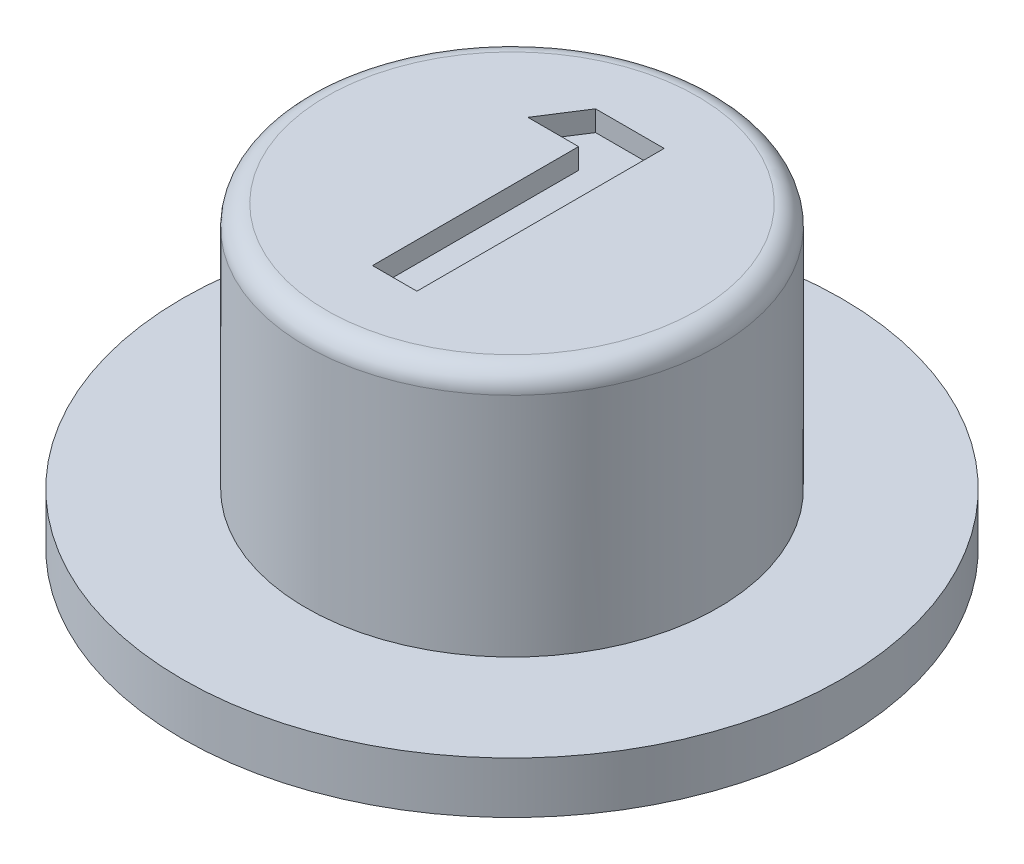
ISO-10303-21;
HEADER;
FILE_DESCRIPTION(('STEP AP214'),'2;1');
FILE_NAME('part.step','',(''),(''),'','','');
FILE_SCHEMA(('AUTOMOTIVE_DESIGN { 1 0 10303 214 1 1 1 1 }'));
ENDSEC;
DATA;
#1=APPLICATION_CONTEXT('core data for automotive mechanical design processes');
#2=APPLICATION_PROTOCOL_DEFINITION('international standard','automotive_design',2000,#1);
#3=PRODUCT_CONTEXT('',#1,'mechanical');
#4=PRODUCT('Part','Part','',(#3));
#5=PRODUCT_RELATED_PRODUCT_CATEGORY('part','',(#4));
#6=PRODUCT_DEFINITION_FORMATION('','',#4);
#7=PRODUCT_DEFINITION_CONTEXT('part definition',#1,'design');
#8=PRODUCT_DEFINITION('design','',#6,#7);
#9=PRODUCT_DEFINITION_SHAPE('','',#8);
#10=(LENGTH_UNIT() NAMED_UNIT(*) SI_UNIT(.MILLI.,.METRE.));
#11=(NAMED_UNIT(*) PLANE_ANGLE_UNIT() SI_UNIT($,.RADIAN.));
#12=(NAMED_UNIT(*) SI_UNIT($,.STERADIAN.) SOLID_ANGLE_UNIT());
#13=UNCERTAINTY_MEASURE_WITH_UNIT(LENGTH_MEASURE(1.E-05),#10,'distance_accuracy_value','');
#14=(GEOMETRIC_REPRESENTATION_CONTEXT(3) GLOBAL_UNCERTAINTY_ASSIGNED_CONTEXT((#13)) GLOBAL_UNIT_ASSIGNED_CONTEXT((#10,
#11,#12)) REPRESENTATION_CONTEXT('',''));
#15=CARTESIAN_POINT('',(0.,0.,0.));
#16=DIRECTION('',(0.,0.,1.));
#17=DIRECTION('',(1.,0.,0.));
#18=AXIS2_PLACEMENT_3D('',#15,#16,#17);
#19=CARTESIAN_POINT('',(0.,7.24999999999999,0.));
#20=DIRECTION('',(0.,-1.,0.));
#21=DIRECTION('',(1.,0.,0.));
#22=AXIS2_PLACEMENT_3D('',#19,#20,#21);
#23=PLANE('',#22);
#24=CARTESIAN_POINT('',(0.,7.24999999999999,0.));
#25=DIRECTION('',(0.,-1.,0.));
#26=DIRECTION('',(1.,0.,0.));
#27=AXIS2_PLACEMENT_3D('',#24,#25,#26);
#28=CIRCLE('',#27,4.49999999999999);
#29=CARTESIAN_POINT('',(4.49999999999999,7.25,0.));
#30=VERTEX_POINT('',#29);
#31=EDGE_CURVE('E41',#30,#30,#28,.F.);
#32=ORIENTED_EDGE('',*,*,#31,.T.);
#33=EDGE_LOOP('',(#32));
#34=FACE_BOUND('',#33,.T.);
#35=DIRECTION('',(0.540859777503419,0.,-0.841112775481952));
#36=VECTOR('',#35,1.);
#37=CARTESIAN_POINT('',(-1.61538461538463,7.24999999999999,-2.));
#38=LINE('',#37,#36);
#39=CARTESIAN_POINT('',(-1.61538461538463,7.24999999999999,-2.));
#40=VERTEX_POINT('',#39);
#41=CARTESIAN_POINT('',(-0.972355769230789,7.24999999999999,-3.));
#42=VERTEX_POINT('',#41);
#43=EDGE_CURVE('E48',#40,#42,#38,.T.);
#44=ORIENTED_EDGE('',*,*,#43,.T.);
#45=DIRECTION('',(1.,0.,0.));
#46=VECTOR('',#45,1.);
#47=CARTESIAN_POINT('',(-0.972355769230789,7.24999999999999,-3.));
#48=LINE('',#47,#46);
#49=CARTESIAN_POINT('',(0.692307692307673,7.24999999999999,-3.));
#50=VERTEX_POINT('',#49);
#51=EDGE_CURVE('E131',#42,#50,#48,.T.);
#52=ORIENTED_EDGE('',*,*,#51,.T.);
#53=DIRECTION('',(0.,0.,1.));
#54=VECTOR('',#53,1.);
#55=CARTESIAN_POINT('',(0.692307692307673,7.24999999999999,-3.));
#56=LINE('',#55,#54);
#57=CARTESIAN_POINT('',(0.692307692307673,7.24999999999999,3.));
#58=VERTEX_POINT('',#57);
#59=EDGE_CURVE('E377',#50,#58,#56,.T.);
#60=ORIENTED_EDGE('',*,*,#59,.T.);
#61=DIRECTION('',(-1.,0.,0.));
#62=VECTOR('',#61,1.);
#63=CARTESIAN_POINT('',(0.692307692307673,7.24999999999999,3.));
#64=LINE('',#63,#62);
#65=CARTESIAN_POINT('',(-0.384615384615404,7.24999999999999,3.));
#66=VERTEX_POINT('',#65);
#67=EDGE_CURVE('E374',#58,#66,#64,.T.);
#68=ORIENTED_EDGE('',*,*,#67,.T.);
#69=DIRECTION('',(0.,0.,-1.));
#70=VECTOR('',#69,1.);
#71=CARTESIAN_POINT('',(-0.384615384615404,7.24999999999999,3.));
#72=LINE('',#71,#70);
#73=CARTESIAN_POINT('',(-0.384615384615404,7.24999999999999,-2.));
#74=VERTEX_POINT('',#73);
#75=EDGE_CURVE('E368',#66,#74,#72,.T.);
#76=ORIENTED_EDGE('',*,*,#75,.T.);
#77=DIRECTION('',(-1.,0.,0.));
#78=VECTOR('',#77,1.);
#79=CARTESIAN_POINT('',(-0.384615384615404,7.24999999999999,-2.));
#80=LINE('',#79,#78);
#81=EDGE_CURVE('E127',#74,#40,#80,.T.);
#82=ORIENTED_EDGE('',*,*,#81,.T.);
#83=EDGE_LOOP('',(#44,#52,#60,#68,#76,#82));
#84=FACE_BOUND('',#83,.T.);
#85=ADVANCED_FACE('F33',(#34,#84),#23,.F.);
#86=CARTESIAN_POINT('',(0.,0.,0.));
#87=DIRECTION('',(0.,1.,0.));
#88=DIRECTION('',(-1.,0.,0.));
#89=AXIS2_PLACEMENT_3D('',#86,#87,#88);
#90=PLANE('',#89);
#91=CARTESIAN_POINT('',(0.,0.,0.));
#92=DIRECTION('',(0.,1.,0.));
#93=DIRECTION('',(-1.,0.,0.));
#94=AXIS2_PLACEMENT_3D('',#91,#92,#93);
#95=CIRCLE('',#94,7.99999999999998);
#96=CARTESIAN_POINT('',(-7.99999999999996,0.,0.));
#97=VERTEX_POINT('',#96);
#98=EDGE_CURVE('E173',#97,#97,#95,.T.);
#99=ORIENTED_EDGE('',*,*,#98,.F.);
#100=EDGE_LOOP('',(#99));
#101=FACE_BOUND('',#100,.T.);
#102=DIRECTION('',(0.,0.,1.));
#103=VECTOR('',#102,1.);
#104=CARTESIAN_POINT('',(-1.25,0.,-1.75));
#105=LINE('',#104,#103);
#106=CARTESIAN_POINT('',(-1.25,0.,-1.75));
#107=VERTEX_POINT('',#106);
#108=CARTESIAN_POINT('',(-1.25,0.,1.75));
#109=VERTEX_POINT('',#108);
#110=EDGE_CURVE('E56',#107,#109,#105,.T.);
#111=ORIENTED_EDGE('',*,*,#110,.T.);
#112=DIRECTION('',(1.,0.,0.));
#113=VECTOR('',#112,1.);
#114=CARTESIAN_POINT('',(-1.25,0.,1.75));
#115=LINE('',#114,#113);
#116=CARTESIAN_POINT('',(1.25,0.,1.75));
#117=VERTEX_POINT('',#116);
#118=EDGE_CURVE('E134',#109,#117,#115,.T.);
#119=ORIENTED_EDGE('',*,*,#118,.T.);
#120=DIRECTION('',(0.,0.,1.));
#121=VECTOR('',#120,1.);
#122=CARTESIAN_POINT('',(1.25,0.,-1.75));
#123=LINE('',#122,#121);
#124=CARTESIAN_POINT('',(1.25,0.,-1.75));
#125=VERTEX_POINT('',#124);
#126=EDGE_CURVE('E155',#125,#117,#123,.T.);
#127=ORIENTED_EDGE('',*,*,#126,.F.);
#128=DIRECTION('',(1.,0.,0.));
#129=VECTOR('',#128,1.);
#130=CARTESIAN_POINT('',(-1.25,0.,-1.75));
#131=LINE('',#130,#129);
#132=EDGE_CURVE('E144',#107,#125,#131,.T.);
#133=ORIENTED_EDGE('',*,*,#132,.F.);
#134=EDGE_LOOP('',(#111,#119,#127,#133));
#135=FACE_BOUND('',#134,.T.);
#136=ADVANCED_FACE('F193',(#101,#135),#90,.F.);
#137=CARTESIAN_POINT('',(0.,7.25,0.));
#138=DIRECTION('',(0.,1.,0.));
#139=DIRECTION('',(-1.,0.,0.));
#140=AXIS2_PLACEMENT_3D('',#137,#138,#139);
#141=CYLINDRICAL_SURFACE('',#140,7.99999999999998);
#142=CARTESIAN_POINT('',(0.,1.24999999999998,0.));
#143=DIRECTION('',(0.,1.,0.));
#144=DIRECTION('',(-1.,0.,0.));
#145=AXIS2_PLACEMENT_3D('',#142,#143,#144);
#146=CIRCLE('',#145,7.99999999999998);
#147=CARTESIAN_POINT('',(-7.99999999999997,1.24999999999996,0.));
#148=VERTEX_POINT('',#147);
#149=EDGE_CURVE('E170',#148,#148,#146,.T.);
#150=ORIENTED_EDGE('',*,*,#149,.F.);
#151=EDGE_LOOP('',(#150));
#152=FACE_BOUND('',#151,.T.);
#153=ORIENTED_EDGE('',*,*,#98,.T.);
#154=EDGE_LOOP('',(#153));
#155=FACE_BOUND('',#154,.T.);
#156=ADVANCED_FACE('F198',(#152,#155),#141,.T.);
#157=CARTESIAN_POINT('',(5.,1.25,0.));
#158=DIRECTION('',(0.,-1.,0.));
#159=DIRECTION('',(1.,0.,0.));
#160=AXIS2_PLACEMENT_3D('',#157,#158,#159);
#161=PLANE('',#160);
#162=CARTESIAN_POINT('',(0.,1.24999999999999,0.));
#163=DIRECTION('',(0.,1.,0.));
#164=DIRECTION('',(-1.,0.,0.));
#165=AXIS2_PLACEMENT_3D('',#162,#163,#164);
#166=CIRCLE('',#165,4.99999999999998);
#167=CARTESIAN_POINT('',(-4.99999999999997,1.24999999999997,0.));
#168=VERTEX_POINT('',#167);
#169=EDGE_CURVE('E167',#168,#168,#166,.T.);
#170=ORIENTED_EDGE('',*,*,#169,.F.);
#171=EDGE_LOOP('',(#170));
#172=FACE_BOUND('',#171,.T.);
#173=ORIENTED_EDGE('',*,*,#149,.T.);
#174=EDGE_LOOP('',(#173));
#175=FACE_BOUND('',#174,.T.);
#176=ADVANCED_FACE('F207',(#172,#175),#161,.F.);
#177=CARTESIAN_POINT('',(0.,7.25,0.));
#178=DIRECTION('',(0.,1.,0.));
#179=DIRECTION('',(-1.,0.,0.));
#180=AXIS2_PLACEMENT_3D('',#177,#178,#179);
#181=CYLINDRICAL_SURFACE('',#180,4.99999999999999);
#182=CARTESIAN_POINT('',(0.,6.74999999999999,0.));
#183=DIRECTION('',(0.,-1.,0.));
#184=DIRECTION('',(1.,0.,0.));
#185=AXIS2_PLACEMENT_3D('',#182,#183,#184);
#186=CIRCLE('',#185,4.99999999999999);
#187=CARTESIAN_POINT('',(4.99999999999999,6.75000000000001,0.));
#188=VERTEX_POINT('',#187);
#189=EDGE_CURVE('E11',#188,#188,#186,.T.);
#190=ORIENTED_EDGE('',*,*,#189,.T.);
#191=EDGE_LOOP('',(#190));
#192=FACE_BOUND('',#191,.T.);
#193=ORIENTED_EDGE('',*,*,#169,.T.);
#194=EDGE_LOOP('',(#193));
#195=FACE_BOUND('',#194,.T.);
#196=ADVANCED_FACE('F204',(#192,#195),#181,.T.);
#197=CARTESIAN_POINT('',(-1.25,3.5,-1.75));
#198=DIRECTION('',(1.,0.,0.));
#199=DIRECTION('',(0.,1.,0.));
#200=AXIS2_PLACEMENT_3D('',#197,#198,#199);
#201=PLANE('',#200);
#202=ORIENTED_EDGE('',*,*,#110,.F.);
#203=DIRECTION('',(0.,-1.,0.));
#204=VECTOR('',#203,1.);
#205=CARTESIAN_POINT('',(-1.25,3.5,-1.75));
#206=LINE('',#205,#204);
#207=CARTESIAN_POINT('',(-1.25,3.5,-1.75));
#208=VERTEX_POINT('',#207);
#209=EDGE_CURVE('E151',#208,#107,#206,.T.);
#210=ORIENTED_EDGE('',*,*,#209,.F.);
#211=DIRECTION('',(0.,0.,1.));
#212=VECTOR('',#211,1.);
#213=CARTESIAN_POINT('',(-1.25,3.5,-1.75));
#214=LINE('',#213,#212);
#215=CARTESIAN_POINT('',(-1.25,3.5,1.75));
#216=VERTEX_POINT('',#215);
#217=EDGE_CURVE('E140',#208,#216,#214,.T.);
#218=ORIENTED_EDGE('',*,*,#217,.T.);
#219=DIRECTION('',(0.,-1.,0.));
#220=VECTOR('',#219,1.);
#221=CARTESIAN_POINT('',(-1.25,3.5,1.75));
#222=LINE('',#221,#220);
#223=EDGE_CURVE('E165',#216,#109,#222,.T.);
#224=ORIENTED_EDGE('',*,*,#223,.T.);
#225=EDGE_LOOP('',(#202,#210,#218,#224));
#226=FACE_BOUND('',#225,.T.);
#227=ADVANCED_FACE('F202',(#226),#201,.T.);
#228=CARTESIAN_POINT('',(-1.25,3.5,1.75));
#229=DIRECTION('',(0.,0.,-1.));
#230=DIRECTION('',(-1.,0.,0.));
#231=AXIS2_PLACEMENT_3D('',#228,#229,#230);
#232=PLANE('',#231);
#233=ORIENTED_EDGE('',*,*,#118,.F.);
#234=ORIENTED_EDGE('',*,*,#223,.F.);
#235=DIRECTION('',(1.,0.,0.));
#236=VECTOR('',#235,1.);
#237=CARTESIAN_POINT('',(-1.25,3.5,1.75));
#238=LINE('',#237,#236);
#239=CARTESIAN_POINT('',(1.25,3.5,1.75));
#240=VERTEX_POINT('',#239);
#241=EDGE_CURVE('E143',#216,#240,#238,.T.);
#242=ORIENTED_EDGE('',*,*,#241,.T.);
#243=DIRECTION('',(0.,-1.,0.));
#244=VECTOR('',#243,1.);
#245=CARTESIAN_POINT('',(1.25,3.5,1.75));
#246=LINE('',#245,#244);
#247=EDGE_CURVE('E163',#240,#117,#246,.T.);
#248=ORIENTED_EDGE('',*,*,#247,.T.);
#249=EDGE_LOOP('',(#233,#234,#242,#248));
#250=FACE_BOUND('',#249,.T.);
#251=ADVANCED_FACE('F229',(#250),#232,.T.);
#252=CARTESIAN_POINT('',(1.25,3.5,-1.75));
#253=DIRECTION('',(1.,0.,0.));
#254=DIRECTION('',(0.,1.,0.));
#255=AXIS2_PLACEMENT_3D('',#252,#253,#254);
#256=PLANE('',#255);
#257=ORIENTED_EDGE('',*,*,#126,.T.);
#258=ORIENTED_EDGE('',*,*,#247,.F.);
#259=DIRECTION('',(0.,0.,1.));
#260=VECTOR('',#259,1.);
#261=CARTESIAN_POINT('',(1.25,3.5,-1.75));
#262=LINE('',#261,#260);
#263=CARTESIAN_POINT('',(1.25,3.5,-1.75));
#264=VERTEX_POINT('',#263);
#265=EDGE_CURVE('E146',#264,#240,#262,.T.);
#266=ORIENTED_EDGE('',*,*,#265,.F.);
#267=DIRECTION('',(0.,-1.,0.));
#268=VECTOR('',#267,1.);
#269=CARTESIAN_POINT('',(1.25,3.5,-1.75));
#270=LINE('',#269,#268);
#271=EDGE_CURVE('E161',#264,#125,#270,.T.);
#272=ORIENTED_EDGE('',*,*,#271,.T.);
#273=EDGE_LOOP('',(#257,#258,#266,#272));
#274=FACE_BOUND('',#273,.T.);
#275=ADVANCED_FACE('F231',(#274),#256,.F.);
#276=CARTESIAN_POINT('',(-1.25,3.5,-1.75));
#277=DIRECTION('',(0.,0.,-1.));
#278=DIRECTION('',(-1.,0.,0.));
#279=AXIS2_PLACEMENT_3D('',#276,#277,#278);
#280=PLANE('',#279);
#281=ORIENTED_EDGE('',*,*,#132,.T.);
#282=ORIENTED_EDGE('',*,*,#271,.F.);
#283=DIRECTION('',(1.,0.,0.));
#284=VECTOR('',#283,1.);
#285=CARTESIAN_POINT('',(-1.25,3.5,-1.75));
#286=LINE('',#285,#284);
#287=EDGE_CURVE('E149',#208,#264,#286,.T.);
#288=ORIENTED_EDGE('',*,*,#287,.F.);
#289=ORIENTED_EDGE('',*,*,#209,.T.);
#290=EDGE_LOOP('',(#281,#282,#288,#289));
#291=FACE_BOUND('',#290,.T.);
#292=ADVANCED_FACE('F188',(#291),#280,.F.);
#293=CARTESIAN_POINT('',(0.,3.5,0.));
#294=DIRECTION('',(0.,1.,0.));
#295=DIRECTION('',(-1.,0.,0.));
#296=AXIS2_PLACEMENT_3D('',#293,#294,#295);
#297=PLANE('',#296);
#298=ORIENTED_EDGE('',*,*,#217,.F.);
#299=ORIENTED_EDGE('',*,*,#287,.T.);
#300=ORIENTED_EDGE('',*,*,#265,.T.);
#301=ORIENTED_EDGE('',*,*,#241,.F.);
#302=EDGE_LOOP('',(#298,#299,#300,#301));
#303=FACE_BOUND('',#302,.T.);
#304=ADVANCED_FACE('F181',(#303),#297,.F.);
#305=CARTESIAN_POINT('',(0.,6.74999999999999,0.));
#306=DIRECTION('',(0.,-1.,0.));
#307=DIRECTION('',(1.,0.,0.));
#308=AXIS2_PLACEMENT_3D('',#305,#306,#307);
#309=TOROIDAL_SURFACE('',#308,4.49999999999999,0.5);
#310=ORIENTED_EDGE('',*,*,#189,.F.);
#311=EDGE_LOOP('',(#310));
#312=FACE_BOUND('',#311,.T.);
#313=ORIENTED_EDGE('',*,*,#31,.F.);
#314=EDGE_LOOP('',(#313));
#315=FACE_BOUND('',#314,.T.);
#316=ADVANCED_FACE('F35',(#312,#315),#309,.T.);
#317=CARTESIAN_POINT('',(-1.61538461538463,6.74999999999999,-2.));
#318=DIRECTION('',(0.841112775481952,0.,0.540859777503419));
#319=DIRECTION('',(0.540859777503419,0.,-0.841112775481952));
#320=AXIS2_PLACEMENT_3D('',#317,#318,#319);
#321=PLANE('',#320);
#322=ORIENTED_EDGE('',*,*,#43,.F.);
#323=DIRECTION('',(0.,1.,0.));
#324=VECTOR('',#323,1.);
#325=CARTESIAN_POINT('',(-1.61538461538463,6.74999999999999,-2.));
#326=LINE('',#325,#324);
#327=CARTESIAN_POINT('',(-1.61538461538463,6.74999999999999,-2.));
#328=VERTEX_POINT('',#327);
#329=EDGE_CURVE('E126',#328,#40,#326,.T.);
#330=ORIENTED_EDGE('',*,*,#329,.F.);
#331=DIRECTION('',(0.540859777503419,0.,-0.841112775481952));
#332=VECTOR('',#331,1.);
#333=CARTESIAN_POINT('',(-1.61538461538463,6.74999999999999,-2.));
#334=LINE('',#333,#332);
#335=CARTESIAN_POINT('',(-0.972355769230788,6.74999999999999,-3.));
#336=VERTEX_POINT('',#335);
#337=EDGE_CURVE('E117',#328,#336,#334,.T.);
#338=ORIENTED_EDGE('',*,*,#337,.T.);
#339=DIRECTION('',(0.,1.,0.));
#340=VECTOR('',#339,1.);
#341=CARTESIAN_POINT('',(-0.972355769230788,6.74999999999999,-3.));
#342=LINE('',#341,#340);
#343=EDGE_CURVE('E125',#336,#42,#342,.T.);
#344=ORIENTED_EDGE('',*,*,#343,.T.);
#345=EDGE_LOOP('',(#322,#330,#338,#344));
#346=FACE_BOUND('',#345,.T.);
#347=ADVANCED_FACE('F124',(#346),#321,.T.);
#348=CARTESIAN_POINT('',(-0.972355769230788,6.74999999999999,-3.));
#349=DIRECTION('',(0.,0.,1.));
#350=DIRECTION('',(1.,0.,0.));
#351=AXIS2_PLACEMENT_3D('',#348,#349,#350);
#352=PLANE('',#351);
#353=ORIENTED_EDGE('',*,*,#51,.F.);
#354=ORIENTED_EDGE('',*,*,#343,.F.);
#355=DIRECTION('',(1.,0.,0.));
#356=VECTOR('',#355,1.);
#357=CARTESIAN_POINT('',(-0.972355769230788,6.74999999999999,-3.));
#358=LINE('',#357,#356);
#359=CARTESIAN_POINT('',(0.692307692307674,6.74999999999999,-3.));
#360=VERTEX_POINT('',#359);
#361=EDGE_CURVE('E113',#336,#360,#358,.T.);
#362=ORIENTED_EDGE('',*,*,#361,.T.);
#363=DIRECTION('',(0.,1.,0.));
#364=VECTOR('',#363,1.);
#365=CARTESIAN_POINT('',(0.692307692307674,6.74999999999999,-3.));
#366=LINE('',#365,#364);
#367=EDGE_CURVE('E132',#360,#50,#366,.T.);
#368=ORIENTED_EDGE('',*,*,#367,.T.);
#369=EDGE_LOOP('',(#353,#354,#362,#368));
#370=FACE_BOUND('',#369,.T.);
#371=ADVANCED_FACE('F129',(#370),#352,.T.);
#372=CARTESIAN_POINT('',(0.692307692307674,6.74999999999999,-3.));
#373=DIRECTION('',(-1.,0.,0.));
#374=DIRECTION('',(0.,-1.,0.));
#375=AXIS2_PLACEMENT_3D('',#372,#373,#374);
#376=PLANE('',#375);
#377=ORIENTED_EDGE('',*,*,#59,.F.);
#378=ORIENTED_EDGE('',*,*,#367,.F.);
#379=DIRECTION('',(0.,0.,1.));
#380=VECTOR('',#379,1.);
#381=CARTESIAN_POINT('',(0.692307692307674,6.74999999999999,-3.));
#382=LINE('',#381,#380);
#383=CARTESIAN_POINT('',(0.692307692307674,6.74999999999999,3.));
#384=VERTEX_POINT('',#383);
#385=EDGE_CURVE('E119',#360,#384,#382,.T.);
#386=ORIENTED_EDGE('',*,*,#385,.T.);
#387=DIRECTION('',(0.,1.,0.));
#388=VECTOR('',#387,1.);
#389=CARTESIAN_POINT('',(0.692307692307674,6.74999999999999,3.));
#390=LINE('',#389,#388);
#391=EDGE_CURVE('E136',#384,#58,#390,.T.);
#392=ORIENTED_EDGE('',*,*,#391,.T.);
#393=EDGE_LOOP('',(#377,#378,#386,#392));
#394=FACE_BOUND('',#393,.T.);
#395=ADVANCED_FACE('F242',(#394),#376,.T.);
#396=CARTESIAN_POINT('',(0.692307692307674,6.74999999999999,3.));
#397=DIRECTION('',(0.,0.,-1.));
#398=DIRECTION('',(-1.,0.,0.));
#399=AXIS2_PLACEMENT_3D('',#396,#397,#398);
#400=PLANE('',#399);
#401=ORIENTED_EDGE('',*,*,#67,.F.);
#402=ORIENTED_EDGE('',*,*,#391,.F.);
#403=DIRECTION('',(-1.,0.,0.));
#404=VECTOR('',#403,1.);
#405=CARTESIAN_POINT('',(0.692307692307674,6.74999999999999,3.));
#406=LINE('',#405,#404);
#407=CARTESIAN_POINT('',(-0.384615384615403,6.74999999999999,3.));
#408=VERTEX_POINT('',#407);
#409=EDGE_CURVE('E393',#384,#408,#406,.T.);
#410=ORIENTED_EDGE('',*,*,#409,.T.);
#411=DIRECTION('',(0.,1.,0.));
#412=VECTOR('',#411,1.);
#413=CARTESIAN_POINT('',(-0.384615384615403,6.74999999999999,3.));
#414=LINE('',#413,#412);
#415=EDGE_CURVE('E384',#408,#66,#414,.T.);
#416=ORIENTED_EDGE('',*,*,#415,.T.);
#417=EDGE_LOOP('',(#401,#402,#410,#416));
#418=FACE_BOUND('',#417,.T.);
#419=ADVANCED_FACE('F245',(#418),#400,.T.);
#420=CARTESIAN_POINT('',(-0.384615384615403,6.74999999999999,3.));
#421=DIRECTION('',(1.,0.,0.));
#422=DIRECTION('',(0.,1.,0.));
#423=AXIS2_PLACEMENT_3D('',#420,#421,#422);
#424=PLANE('',#423);
#425=ORIENTED_EDGE('',*,*,#75,.F.);
#426=ORIENTED_EDGE('',*,*,#415,.F.);
#427=DIRECTION('',(0.,0.,-1.));
#428=VECTOR('',#427,1.);
#429=CARTESIAN_POINT('',(-0.384615384615403,6.74999999999999,3.));
#430=LINE('',#429,#428);
#431=CARTESIAN_POINT('',(-0.384615384615403,6.74999999999999,-2.));
#432=VERTEX_POINT('',#431);
#433=EDGE_CURVE('E391',#408,#432,#430,.T.);
#434=ORIENTED_EDGE('',*,*,#433,.T.);
#435=DIRECTION('',(0.,1.,0.));
#436=VECTOR('',#435,1.);
#437=CARTESIAN_POINT('',(-0.384615384615403,6.74999999999999,-2.));
#438=LINE('',#437,#436);
#439=EDGE_CURVE('E367',#432,#74,#438,.T.);
#440=ORIENTED_EDGE('',*,*,#439,.T.);
#441=EDGE_LOOP('',(#425,#426,#434,#440));
#442=FACE_BOUND('',#441,.T.);
#443=ADVANCED_FACE('F249',(#442),#424,.T.);
#444=CARTESIAN_POINT('',(-0.384615384615403,6.74999999999999,-2.));
#445=DIRECTION('',(0.,0.,-1.));
#446=DIRECTION('',(-1.,0.,0.));
#447=AXIS2_PLACEMENT_3D('',#444,#445,#446);
#448=PLANE('',#447);
#449=ORIENTED_EDGE('',*,*,#81,.F.);
#450=ORIENTED_EDGE('',*,*,#439,.F.);
#451=DIRECTION('',(-1.,0.,0.));
#452=VECTOR('',#451,1.);
#453=CARTESIAN_POINT('',(-0.384615384615403,6.74999999999999,-2.));
#454=LINE('',#453,#452);
#455=EDGE_CURVE('E382',#432,#328,#454,.T.);
#456=ORIENTED_EDGE('',*,*,#455,.T.);
#457=ORIENTED_EDGE('',*,*,#329,.T.);
#458=EDGE_LOOP('',(#449,#450,#456,#457));
#459=FACE_BOUND('',#458,.T.);
#460=ADVANCED_FACE('F253',(#459),#448,.T.);
#461=CARTESIAN_POINT('',(0.,6.74999999999999,0.));
#462=DIRECTION('',(0.,-1.,0.));
#463=DIRECTION('',(1.,0.,0.));
#464=AXIS2_PLACEMENT_3D('',#461,#462,#463);
#465=PLANE('',#464);
#466=ORIENTED_EDGE('',*,*,#337,.F.);
#467=ORIENTED_EDGE('',*,*,#455,.F.);
#468=ORIENTED_EDGE('',*,*,#433,.F.);
#469=ORIENTED_EDGE('',*,*,#409,.F.);
#470=ORIENTED_EDGE('',*,*,#385,.F.);
#471=ORIENTED_EDGE('',*,*,#361,.F.);
#472=EDGE_LOOP('',(#466,#467,#468,#469,#470,#471));
#473=FACE_BOUND('',#472,.T.);
#474=ADVANCED_FACE('F115',(#473),#465,.F.);
#475=CLOSED_SHELL('',(#85,#136,#156,#176,#196,#227,#251,#275,#292,#304,#316,#347,#371,#395,#419,
#443,#460,#474));
#476=MANIFOLD_SOLID_BREP('B2',#475);
#477=ADVANCED_BREP_SHAPE_REPRESENTATION('',(#18,#476),#14);
#478=SHAPE_DEFINITION_REPRESENTATION(#9,#477);
ENDSEC;
END-ISO-10303-21;
